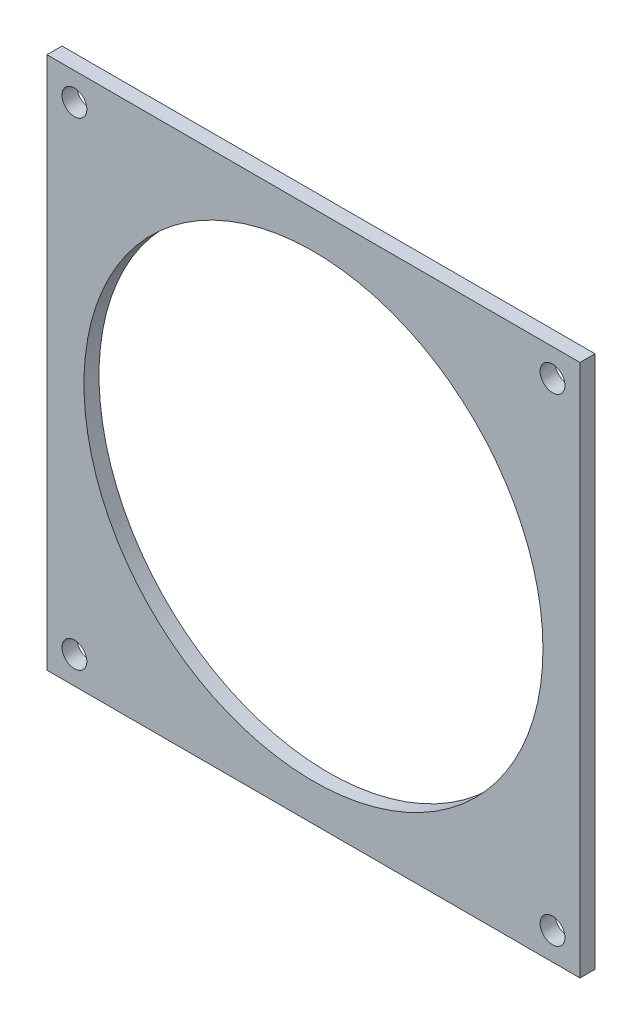
ISO-10303-21;
HEADER;
FILE_DESCRIPTION(('STEP AP214'),'2;1');
FILE_NAME('part.step','',(''),(''),'','','');
FILE_SCHEMA(('AUTOMOTIVE_DESIGN { 1 0 10303 214 1 1 1 1 }'));
ENDSEC;
DATA;
#1=APPLICATION_CONTEXT('core data for automotive mechanical design processes');
#2=APPLICATION_PROTOCOL_DEFINITION('international standard','automotive_design',2000,#1);
#3=PRODUCT_CONTEXT('',#1,'mechanical');
#4=PRODUCT('Part','Part','',(#3));
#5=PRODUCT_RELATED_PRODUCT_CATEGORY('part','',(#4));
#6=PRODUCT_DEFINITION_FORMATION('','',#4);
#7=PRODUCT_DEFINITION_CONTEXT('part definition',#1,'design');
#8=PRODUCT_DEFINITION('design','',#6,#7);
#9=PRODUCT_DEFINITION_SHAPE('','',#8);
#10=(LENGTH_UNIT() NAMED_UNIT(*) SI_UNIT(.MILLI.,.METRE.));
#11=(NAMED_UNIT(*) PLANE_ANGLE_UNIT() SI_UNIT($,.RADIAN.));
#12=(NAMED_UNIT(*) SI_UNIT($,.STERADIAN.) SOLID_ANGLE_UNIT());
#13=UNCERTAINTY_MEASURE_WITH_UNIT(LENGTH_MEASURE(1.E-05),#10,'distance_accuracy_value','');
#14=(GEOMETRIC_REPRESENTATION_CONTEXT(3) GLOBAL_UNCERTAINTY_ASSIGNED_CONTEXT((#13)) GLOBAL_UNIT_ASSIGNED_CONTEXT((#10,
#11,#12)) REPRESENTATION_CONTEXT('',''));
#15=CARTESIAN_POINT('',(0.,0.,0.));
#16=DIRECTION('',(0.,0.,1.));
#17=DIRECTION('',(1.,0.,0.));
#18=AXIS2_PLACEMENT_3D('',#15,#16,#17);
#19=CARTESIAN_POINT('',(0.,0.,5.));
#20=DIRECTION('',(0.,1.,0.));
#21=DIRECTION('',(0.,0.,1.));
#22=AXIS2_PLACEMENT_3D('',#19,#20,#21);
#23=PLANE('',#22);
#24=DIRECTION('',(1.,0.,0.));
#25=VECTOR('',#24,1.);
#26=CARTESIAN_POINT('',(0.,0.,0.));
#27=LINE('',#26,#25);
#28=CARTESIAN_POINT('',(0.,0.,0.));
#29=VERTEX_POINT('',#28);
#30=CARTESIAN_POINT('',(177.,0.,0.));
#31=VERTEX_POINT('',#30);
#32=EDGE_CURVE('E115',#29,#31,#27,.T.);
#33=ORIENTED_EDGE('',*,*,#32,.T.);
#34=DIRECTION('',(0.,0.,-1.));
#35=VECTOR('',#34,1.);
#36=CARTESIAN_POINT('',(177.,0.,5.));
#37=LINE('',#36,#35);
#38=CARTESIAN_POINT('',(177.,0.,5.));
#39=VERTEX_POINT('',#38);
#40=EDGE_CURVE('E11',#39,#31,#37,.T.);
#41=ORIENTED_EDGE('',*,*,#40,.F.);
#42=DIRECTION('',(1.,0.,0.));
#43=VECTOR('',#42,1.);
#44=CARTESIAN_POINT('',(0.,0.,5.));
#45=LINE('',#44,#43);
#46=CARTESIAN_POINT('',(0.,0.,5.));
#47=VERTEX_POINT('',#46);
#48=EDGE_CURVE('E86',#47,#39,#45,.T.);
#49=ORIENTED_EDGE('',*,*,#48,.F.);
#50=DIRECTION('',(0.,0.,-1.));
#51=VECTOR('',#50,1.);
#52=CARTESIAN_POINT('',(0.,0.,5.));
#53=LINE('',#52,#51);
#54=EDGE_CURVE('E52',#47,#29,#53,.T.);
#55=ORIENTED_EDGE('',*,*,#54,.T.);
#56=EDGE_LOOP('',(#33,#41,#49,#55));
#57=FACE_BOUND('',#56,.T.);
#58=ADVANCED_FACE('F35',(#57),#23,.F.);
#59=CARTESIAN_POINT('',(177.,0.,5.));
#60=DIRECTION('',(-1.,0.,0.));
#61=DIRECTION('',(0.,-1.,0.));
#62=AXIS2_PLACEMENT_3D('',#59,#60,#61);
#63=PLANE('',#62);
#64=DIRECTION('',(0.,1.,0.));
#65=VECTOR('',#64,1.);
#66=CARTESIAN_POINT('',(177.,0.,0.));
#67=LINE('',#66,#65);
#68=CARTESIAN_POINT('',(177.,177.,0.));
#69=VERTEX_POINT('',#68);
#70=EDGE_CURVE('E91',#31,#69,#67,.T.);
#71=ORIENTED_EDGE('',*,*,#70,.T.);
#72=DIRECTION('',(0.,0.,-1.));
#73=VECTOR('',#72,1.);
#74=CARTESIAN_POINT('',(177.,177.,5.));
#75=LINE('',#74,#73);
#76=CARTESIAN_POINT('',(177.,177.,5.));
#77=VERTEX_POINT('',#76);
#78=EDGE_CURVE('E44',#77,#69,#75,.T.);
#79=ORIENTED_EDGE('',*,*,#78,.F.);
#80=DIRECTION('',(0.,1.,0.));
#81=VECTOR('',#80,1.);
#82=CARTESIAN_POINT('',(177.,0.,5.));
#83=LINE('',#82,#81);
#84=EDGE_CURVE('E77',#39,#77,#83,.T.);
#85=ORIENTED_EDGE('',*,*,#84,.F.);
#86=ORIENTED_EDGE('',*,*,#40,.T.);
#87=EDGE_LOOP('',(#71,#79,#85,#86));
#88=FACE_BOUND('',#87,.T.);
#89=ADVANCED_FACE('F90',(#88),#63,.F.);
#90=CARTESIAN_POINT('',(0.,177.,5.));
#91=DIRECTION('',(0.,1.,0.));
#92=DIRECTION('',(0.,0.,1.));
#93=AXIS2_PLACEMENT_3D('',#90,#91,#92);
#94=PLANE('',#93);
#95=DIRECTION('',(1.,0.,0.));
#96=VECTOR('',#95,1.);
#97=CARTESIAN_POINT('',(0.,177.,0.));
#98=LINE('',#97,#96);
#99=CARTESIAN_POINT('',(0.,177.,0.));
#100=VERTEX_POINT('',#99);
#101=EDGE_CURVE('E118',#100,#69,#98,.T.);
#102=ORIENTED_EDGE('',*,*,#101,.F.);
#103=DIRECTION('',(0.,0.,-1.));
#104=VECTOR('',#103,1.);
#105=CARTESIAN_POINT('',(0.,177.,5.));
#106=LINE('',#105,#104);
#107=CARTESIAN_POINT('',(0.,177.,5.));
#108=VERTEX_POINT('',#107);
#109=EDGE_CURVE('E66',#108,#100,#106,.T.);
#110=ORIENTED_EDGE('',*,*,#109,.F.);
#111=DIRECTION('',(1.,0.,0.));
#112=VECTOR('',#111,1.);
#113=CARTESIAN_POINT('',(0.,177.,5.));
#114=LINE('',#113,#112);
#115=EDGE_CURVE('E85',#108,#77,#114,.T.);
#116=ORIENTED_EDGE('',*,*,#115,.T.);
#117=ORIENTED_EDGE('',*,*,#78,.T.);
#118=EDGE_LOOP('',(#102,#110,#116,#117));
#119=FACE_BOUND('',#118,.T.);
#120=ADVANCED_FACE('F94',(#119),#94,.T.);
#121=CARTESIAN_POINT('',(9.125,9.12500000000001,5.));
#122=DIRECTION('',(0.,0.,-1.));
#123=DIRECTION('',(-1.,0.,0.));
#124=AXIS2_PLACEMENT_3D('',#121,#122,#123);
#125=CYLINDRICAL_SURFACE('',#124,4.125);
#126=CARTESIAN_POINT('',(9.125,9.12500000000001,5.));
#127=DIRECTION('',(0.,0.,1.));
#128=DIRECTION('',(1.,0.,0.));
#129=AXIS2_PLACEMENT_3D('',#126,#127,#128);
#130=CIRCLE('',#129,4.125);
#131=CARTESIAN_POINT('',(13.25,9.12500000000001,5.));
#132=VERTEX_POINT('',#131);
#133=EDGE_CURVE('E106',#132,#132,#130,.T.);
#134=ORIENTED_EDGE('',*,*,#133,.T.);
#135=EDGE_LOOP('',(#134));
#136=FACE_BOUND('',#135,.T.);
#137=CARTESIAN_POINT('',(9.125,9.12500000000001,0.));
#138=DIRECTION('',(0.,0.,1.));
#139=DIRECTION('',(1.,0.,0.));
#140=AXIS2_PLACEMENT_3D('',#137,#138,#139);
#141=CIRCLE('',#140,4.125);
#142=CARTESIAN_POINT('',(13.25,9.12500000000001,0.));
#143=VERTEX_POINT('',#142);
#144=EDGE_CURVE('E129',#143,#143,#141,.T.);
#145=ORIENTED_EDGE('',*,*,#144,.F.);
#146=EDGE_LOOP('',(#145));
#147=FACE_BOUND('',#146,.T.);
#148=ADVANCED_FACE('F165',(#136,#147),#125,.F.);
#149=CARTESIAN_POINT('',(167.875,167.875,5.));
#150=DIRECTION('',(0.,0.,-1.));
#151=DIRECTION('',(-1.,0.,0.));
#152=AXIS2_PLACEMENT_3D('',#149,#150,#151);
#153=CYLINDRICAL_SURFACE('',#152,4.125);
#154=CARTESIAN_POINT('',(167.875,167.875,5.));
#155=DIRECTION('',(0.,0.,1.));
#156=DIRECTION('',(1.,0.,0.));
#157=AXIS2_PLACEMENT_3D('',#154,#155,#156);
#158=CIRCLE('',#157,4.125);
#159=CARTESIAN_POINT('',(172.,167.875,5.));
#160=VERTEX_POINT('',#159);
#161=EDGE_CURVE('E103',#160,#160,#158,.T.);
#162=ORIENTED_EDGE('',*,*,#161,.T.);
#163=EDGE_LOOP('',(#162));
#164=FACE_BOUND('',#163,.T.);
#165=CARTESIAN_POINT('',(167.875,167.875,0.));
#166=DIRECTION('',(0.,0.,1.));
#167=DIRECTION('',(1.,0.,0.));
#168=AXIS2_PLACEMENT_3D('',#165,#166,#167);
#169=CIRCLE('',#168,4.125);
#170=CARTESIAN_POINT('',(172.,167.875,0.));
#171=VERTEX_POINT('',#170);
#172=EDGE_CURVE('E126',#171,#171,#169,.T.);
#173=ORIENTED_EDGE('',*,*,#172,.F.);
#174=EDGE_LOOP('',(#173));
#175=FACE_BOUND('',#174,.T.);
#176=ADVANCED_FACE('F172',(#164,#175),#153,.F.);
#177=CARTESIAN_POINT('',(9.12499999999999,167.875,5.));
#178=DIRECTION('',(0.,0.,-1.));
#179=DIRECTION('',(-1.,0.,0.));
#180=AXIS2_PLACEMENT_3D('',#177,#178,#179);
#181=CYLINDRICAL_SURFACE('',#180,4.125);
#182=CARTESIAN_POINT('',(9.12499999999999,167.875,5.));
#183=DIRECTION('',(0.,0.,1.));
#184=DIRECTION('',(1.,0.,0.));
#185=AXIS2_PLACEMENT_3D('',#182,#183,#184);
#186=CIRCLE('',#185,4.125);
#187=CARTESIAN_POINT('',(13.25,167.875,5.));
#188=VERTEX_POINT('',#187);
#189=EDGE_CURVE('E97',#188,#188,#186,.F.);
#190=ORIENTED_EDGE('',*,*,#189,.F.);
#191=EDGE_LOOP('',(#190));
#192=FACE_BOUND('',#191,.T.);
#193=CARTESIAN_POINT('',(9.12499999999999,167.875,0.));
#194=DIRECTION('',(0.,0.,1.));
#195=DIRECTION('',(1.,0.,0.));
#196=AXIS2_PLACEMENT_3D('',#193,#194,#195);
#197=CIRCLE('',#196,4.125);
#198=CARTESIAN_POINT('',(13.25,167.875,0.));
#199=VERTEX_POINT('',#198);
#200=EDGE_CURVE('E123',#199,#199,#197,.F.);
#201=ORIENTED_EDGE('',*,*,#200,.T.);
#202=EDGE_LOOP('',(#201));
#203=FACE_BOUND('',#202,.T.);
#204=ADVANCED_FACE('F169',(#192,#203),#181,.F.);
#205=CARTESIAN_POINT('',(0.,0.,5.));
#206=DIRECTION('',(-1.,0.,0.));
#207=DIRECTION('',(0.,-1.,0.));
#208=AXIS2_PLACEMENT_3D('',#205,#206,#207);
#209=PLANE('',#208);
#210=DIRECTION('',(0.,1.,0.));
#211=VECTOR('',#210,1.);
#212=CARTESIAN_POINT('',(0.,0.,0.));
#213=LINE('',#212,#211);
#214=EDGE_CURVE('E120',#29,#100,#213,.T.);
#215=ORIENTED_EDGE('',*,*,#214,.F.);
#216=ORIENTED_EDGE('',*,*,#54,.F.);
#217=DIRECTION('',(0.,1.,0.));
#218=VECTOR('',#217,1.);
#219=CARTESIAN_POINT('',(0.,0.,5.));
#220=LINE('',#219,#218);
#221=EDGE_CURVE('E95',#47,#108,#220,.T.);
#222=ORIENTED_EDGE('',*,*,#221,.T.);
#223=ORIENTED_EDGE('',*,*,#109,.T.);
#224=EDGE_LOOP('',(#215,#216,#222,#223));
#225=FACE_BOUND('',#224,.T.);
#226=ADVANCED_FACE('F166',(#225),#209,.T.);
#227=CARTESIAN_POINT('',(88.5,88.5,5.));
#228=DIRECTION('',(0.,0.,-1.));
#229=DIRECTION('',(-1.,0.,0.));
#230=AXIS2_PLACEMENT_3D('',#227,#228,#229);
#231=CYLINDRICAL_SURFACE('',#230,76.2);
#232=CARTESIAN_POINT('',(88.5,88.5,5.));
#233=DIRECTION('',(0.,0.,1.));
#234=DIRECTION('',(1.,0.,0.));
#235=AXIS2_PLACEMENT_3D('',#232,#233,#234);
#236=CIRCLE('',#235,76.2);
#237=CARTESIAN_POINT('',(164.7,88.5,5.));
#238=VERTEX_POINT('',#237);
#239=EDGE_CURVE('E135',#238,#238,#236,.T.);
#240=ORIENTED_EDGE('',*,*,#239,.T.);
#241=EDGE_LOOP('',(#240));
#242=FACE_BOUND('',#241,.T.);
#243=CARTESIAN_POINT('',(88.5,88.5,0.));
#244=DIRECTION('',(0.,0.,1.));
#245=DIRECTION('',(1.,0.,0.));
#246=AXIS2_PLACEMENT_3D('',#243,#244,#245);
#247=CIRCLE('',#246,76.2);
#248=CARTESIAN_POINT('',(164.7,88.5,0.));
#249=VERTEX_POINT('',#248);
#250=EDGE_CURVE('E112',#249,#249,#247,.T.);
#251=ORIENTED_EDGE('',*,*,#250,.F.);
#252=EDGE_LOOP('',(#251));
#253=FACE_BOUND('',#252,.T.);
#254=ADVANCED_FACE('F37',(#242,#253),#231,.F.);
#255=CARTESIAN_POINT('',(167.875,9.12500000000001,5.));
#256=DIRECTION('',(0.,0.,-1.));
#257=DIRECTION('',(-1.,0.,0.));
#258=AXIS2_PLACEMENT_3D('',#255,#256,#257);
#259=CYLINDRICAL_SURFACE('',#258,4.125);
#260=CARTESIAN_POINT('',(167.875,9.12500000000001,5.));
#261=DIRECTION('',(0.,0.,1.));
#262=DIRECTION('',(1.,0.,0.));
#263=AXIS2_PLACEMENT_3D('',#260,#261,#262);
#264=CIRCLE('',#263,4.125);
#265=CARTESIAN_POINT('',(172.,9.12500000000001,5.));
#266=VERTEX_POINT('',#265);
#267=EDGE_CURVE('E109',#266,#266,#264,.F.);
#268=ORIENTED_EDGE('',*,*,#267,.F.);
#269=EDGE_LOOP('',(#268));
#270=FACE_BOUND('',#269,.T.);
#271=CARTESIAN_POINT('',(167.875,9.12500000000001,0.));
#272=DIRECTION('',(0.,0.,1.));
#273=DIRECTION('',(1.,0.,0.));
#274=AXIS2_PLACEMENT_3D('',#271,#272,#273);
#275=CIRCLE('',#274,4.125);
#276=CARTESIAN_POINT('',(172.,9.12500000000001,0.));
#277=VERTEX_POINT('',#276);
#278=EDGE_CURVE('E132',#277,#277,#275,.F.);
#279=ORIENTED_EDGE('',*,*,#278,.T.);
#280=EDGE_LOOP('',(#279));
#281=FACE_BOUND('',#280,.T.);
#282=ADVANCED_FACE('F147',(#270,#281),#259,.F.);
#283=CARTESIAN_POINT('',(0.,0.,5.));
#284=DIRECTION('',(0.,0.,1.));
#285=DIRECTION('',(1.,0.,0.));
#286=AXIS2_PLACEMENT_3D('',#283,#284,#285);
#287=PLANE('',#286);
#288=ORIENTED_EDGE('',*,*,#239,.F.);
#289=EDGE_LOOP('',(#288));
#290=FACE_BOUND('',#289,.T.);
#291=ORIENTED_EDGE('',*,*,#48,.T.);
#292=ORIENTED_EDGE('',*,*,#84,.T.);
#293=ORIENTED_EDGE('',*,*,#115,.F.);
#294=ORIENTED_EDGE('',*,*,#221,.F.);
#295=EDGE_LOOP('',(#291,#292,#293,#294));
#296=FACE_BOUND('',#295,.T.);
#297=ORIENTED_EDGE('',*,*,#189,.T.);
#298=EDGE_LOOP('',(#297));
#299=FACE_BOUND('',#298,.T.);
#300=ORIENTED_EDGE('',*,*,#161,.F.);
#301=EDGE_LOOP('',(#300));
#302=FACE_BOUND('',#301,.T.);
#303=ORIENTED_EDGE('',*,*,#133,.F.);
#304=EDGE_LOOP('',(#303));
#305=FACE_BOUND('',#304,.T.);
#306=ORIENTED_EDGE('',*,*,#267,.T.);
#307=EDGE_LOOP('',(#306));
#308=FACE_BOUND('',#307,.T.);
#309=ADVANCED_FACE('F81',(#290,#296,#299,#302,#305,#308),#287,.T.);
#310=CARTESIAN_POINT('',(0.,0.,0.));
#311=DIRECTION('',(0.,0.,1.));
#312=DIRECTION('',(1.,0.,0.));
#313=AXIS2_PLACEMENT_3D('',#310,#311,#312);
#314=PLANE('',#313);
#315=ORIENTED_EDGE('',*,*,#250,.T.);
#316=EDGE_LOOP('',(#315));
#317=FACE_BOUND('',#316,.T.);
#318=ORIENTED_EDGE('',*,*,#32,.F.);
#319=ORIENTED_EDGE('',*,*,#214,.T.);
#320=ORIENTED_EDGE('',*,*,#101,.T.);
#321=ORIENTED_EDGE('',*,*,#70,.F.);
#322=EDGE_LOOP('',(#318,#319,#320,#321));
#323=FACE_BOUND('',#322,.T.);
#324=ORIENTED_EDGE('',*,*,#200,.F.);
#325=EDGE_LOOP('',(#324));
#326=FACE_BOUND('',#325,.T.);
#327=ORIENTED_EDGE('',*,*,#172,.T.);
#328=EDGE_LOOP('',(#327));
#329=FACE_BOUND('',#328,.T.);
#330=ORIENTED_EDGE('',*,*,#144,.T.);
#331=EDGE_LOOP('',(#330));
#332=FACE_BOUND('',#331,.T.);
#333=ORIENTED_EDGE('',*,*,#278,.F.);
#334=EDGE_LOOP('',(#333));
#335=FACE_BOUND('',#334,.T.);
#336=ADVANCED_FACE('F146',(#317,#323,#326,#329,#332,#335),#314,.F.);
#337=CLOSED_SHELL('',(#58,#89,#120,#148,#176,#204,#226,#254,#282,#309,#336));
#338=MANIFOLD_SOLID_BREP('B2',#337);
#339=ADVANCED_BREP_SHAPE_REPRESENTATION('',(#18,#338),#14);
#340=SHAPE_DEFINITION_REPRESENTATION(#9,#339);
ENDSEC;
END-ISO-10303-21;
